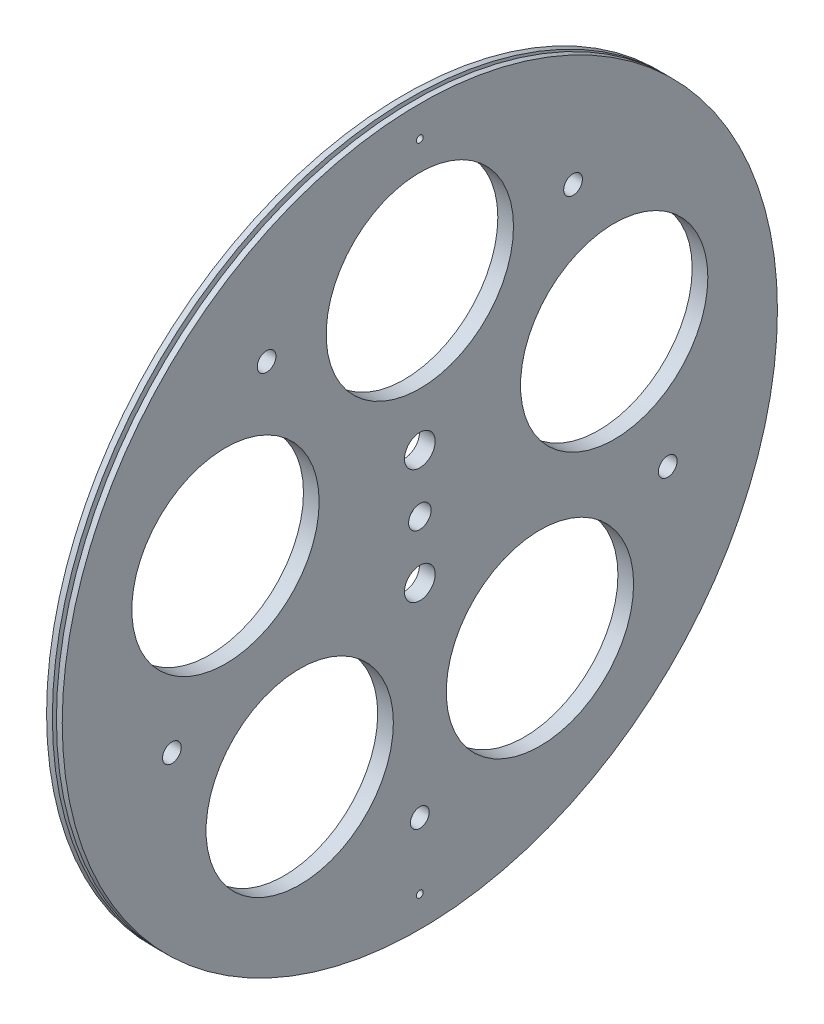
ISO-10303-21;
HEADER;
FILE_DESCRIPTION(('STEP AP214'),'2;1');
FILE_NAME('part.step','',(''),(''),'','','');
FILE_SCHEMA(('AUTOMOTIVE_DESIGN { 1 0 10303 214 1 1 1 1 }'));
ENDSEC;
DATA;
#1=APPLICATION_CONTEXT('core data for automotive mechanical design processes');
#2=APPLICATION_PROTOCOL_DEFINITION('international standard','automotive_design',2000,#1);
#3=PRODUCT_CONTEXT('',#1,'mechanical');
#4=PRODUCT('Part','Part','',(#3));
#5=PRODUCT_RELATED_PRODUCT_CATEGORY('part','',(#4));
#6=PRODUCT_DEFINITION_FORMATION('','',#4);
#7=PRODUCT_DEFINITION_CONTEXT('part definition',#1,'design');
#8=PRODUCT_DEFINITION('design','',#6,#7);
#9=PRODUCT_DEFINITION_SHAPE('','',#8);
#10=(LENGTH_UNIT() NAMED_UNIT(*) SI_UNIT(.MILLI.,.METRE.));
#11=(NAMED_UNIT(*) PLANE_ANGLE_UNIT() SI_UNIT($,.RADIAN.));
#12=(NAMED_UNIT(*) SI_UNIT($,.STERADIAN.) SOLID_ANGLE_UNIT());
#13=UNCERTAINTY_MEASURE_WITH_UNIT(LENGTH_MEASURE(1.E-05),#10,'distance_accuracy_value','');
#14=(GEOMETRIC_REPRESENTATION_CONTEXT(3) GLOBAL_UNCERTAINTY_ASSIGNED_CONTEXT((#13)) GLOBAL_UNIT_ASSIGNED_CONTEXT((#10,
#11,#12)) REPRESENTATION_CONTEXT('',''));
#15=CARTESIAN_POINT('',(0.,0.,0.));
#16=DIRECTION('',(0.,0.,1.));
#17=DIRECTION('',(1.,0.,0.));
#18=AXIS2_PLACEMENT_3D('',#15,#16,#17);
#19=CARTESIAN_POINT('',(-21.9,0.,0.));
#20=DIRECTION('',(1.,0.,0.));
#21=DIRECTION('',(0.,0.,-1.));
#22=AXIS2_PLACEMENT_3D('',#19,#20,#21);
#23=PLANE('',#22);
#24=CARTESIAN_POINT('',(-21.9,16.9,0.));
#25=DIRECTION('',(1.,0.,0.));
#26=DIRECTION('',(0.,0.,-1.));
#27=AXIS2_PLACEMENT_3D('',#24,#25,#26);
#28=CIRCLE('',#27,4.5);
#29=CARTESIAN_POINT('',(-21.9,16.9,-4.5));
#30=VERTEX_POINT('',#29);
#31=EDGE_CURVE('E172',#30,#30,#28,.T.);
#32=ORIENTED_EDGE('',*,*,#31,.F.);
#33=EDGE_LOOP('',(#32));
#34=FACE_BOUND('',#33,.T.);
#35=CARTESIAN_POINT('',(-21.9,-96.,0.));
#36=DIRECTION('',(1.,0.,0.));
#37=DIRECTION('',(0.,0.,-1.));
#38=AXIS2_PLACEMENT_3D('',#35,#36,#37);
#39=CIRCLE('',#38,1.);
#40=CARTESIAN_POINT('',(-21.9,-96.,-1.));
#41=VERTEX_POINT('',#40);
#42=EDGE_CURVE('E176',#41,#41,#39,.F.);
#43=ORIENTED_EDGE('',*,*,#42,.T.);
#44=EDGE_LOOP('',(#43));
#45=FACE_BOUND('',#44,.T.);
#46=CARTESIAN_POINT('',(-21.9,60.,0.));
#47=DIRECTION('',(1.,0.,0.));
#48=DIRECTION('',(0.,0.,-1.));
#49=AXIS2_PLACEMENT_3D('',#46,#47,#48);
#50=CIRCLE('',#49,27.5);
#51=CARTESIAN_POINT('',(-21.9,60.,-27.5));
#52=VERTEX_POINT('',#51);
#53=EDGE_CURVE('E180',#52,#52,#50,.T.);
#54=ORIENTED_EDGE('',*,*,#53,.F.);
#55=EDGE_LOOP('',(#54));
#56=FACE_BOUND('',#55,.T.);
#57=CARTESIAN_POINT('',(-21.9,18.5410196624969,-57.0633909777092));
#58=DIRECTION('',(1.,0.,0.));
#59=DIRECTION('',(0.,0.,-1.));
#60=AXIS2_PLACEMENT_3D('',#57,#58,#59);
#61=CIRCLE('',#60,27.5000000000022);
#62=CARTESIAN_POINT('',(-21.9,18.5410196624969,-84.5633909777114));
#63=VERTEX_POINT('',#62);
#64=EDGE_CURVE('E184',#63,#63,#61,.T.);
#65=ORIENTED_EDGE('',*,*,#64,.F.);
#66=EDGE_LOOP('',(#65));
#67=FACE_BOUND('',#66,.T.);
#68=CARTESIAN_POINT('',(-21.9,-48.5410196624968,-35.2671151375484));
#69=DIRECTION('',(1.,0.,0.));
#70=DIRECTION('',(0.,0.,-1.));
#71=AXIS2_PLACEMENT_3D('',#68,#69,#70);
#72=CIRCLE('',#71,27.5000000000044);
#73=CARTESIAN_POINT('',(-21.9,-48.5410196624968,-62.7671151375528));
#74=VERTEX_POINT('',#73);
#75=EDGE_CURVE('E188',#74,#74,#72,.T.);
#76=ORIENTED_EDGE('',*,*,#75,.F.);
#77=EDGE_LOOP('',(#76));
#78=FACE_BOUND('',#77,.T.);
#79=CARTESIAN_POINT('',(-21.9,-48.5410196624969,35.2671151375484));
#80=DIRECTION('',(1.,0.,0.));
#81=DIRECTION('',(0.,0.,-1.));
#82=AXIS2_PLACEMENT_3D('',#79,#80,#81);
#83=CIRCLE('',#82,27.5000000000036);
#84=CARTESIAN_POINT('',(-21.9,-48.5410196624969,7.76711513754475));
#85=VERTEX_POINT('',#84);
#86=EDGE_CURVE('E192',#85,#85,#83,.T.);
#87=ORIENTED_EDGE('',*,*,#86,.F.);
#88=EDGE_LOOP('',(#87));
#89=FACE_BOUND('',#88,.T.);
#90=CARTESIAN_POINT('',(-21.9,0.,0.));
#91=DIRECTION('',(1.,0.,0.));
#92=DIRECTION('',(0.,0.,-1.));
#93=AXIS2_PLACEMENT_3D('',#90,#91,#92);
#94=CIRCLE('',#93,3.3);
#95=CARTESIAN_POINT('',(-21.9,0.,-3.3));
#96=VERTEX_POINT('',#95);
#97=EDGE_CURVE('E196',#96,#96,#94,.T.);
#98=ORIENTED_EDGE('',*,*,#97,.F.);
#99=EDGE_LOOP('',(#98));
#100=FACE_BOUND('',#99,.T.);
#101=CARTESIAN_POINT('',(-21.9,61.9229856737465,-44.9896825530446));
#102=DIRECTION('',(1.,0.,0.));
#103=DIRECTION('',(0.,0.,-1.));
#104=AXIS2_PLACEMENT_3D('',#101,#102,#103);
#105=CIRCLE('',#104,2.75);
#106=CARTESIAN_POINT('',(-21.9,61.9229856737465,-47.7396825530446));
#107=VERTEX_POINT('',#106);
#108=EDGE_CURVE('E200',#107,#107,#105,.T.);
#109=ORIENTED_EDGE('',*,*,#108,.F.);
#110=EDGE_LOOP('',(#109));
#111=FACE_BOUND('',#110,.T.);
#112=CARTESIAN_POINT('',(-21.9,61.9229856737473,44.9896825530433));
#113=DIRECTION('',(1.,0.,0.));
#114=DIRECTION('',(0.,0.,-1.));
#115=AXIS2_PLACEMENT_3D('',#112,#113,#114);
#116=CIRCLE('',#115,2.75);
#117=CARTESIAN_POINT('',(-21.9,61.9229856737473,42.2396825530433));
#118=VERTEX_POINT('',#117);
#119=EDGE_CURVE('E204',#118,#118,#116,.T.);
#120=ORIENTED_EDGE('',*,*,#119,.F.);
#121=EDGE_LOOP('',(#120));
#122=FACE_BOUND('',#121,.T.);
#123=CARTESIAN_POINT('',(-21.9,-23.6524758424981,72.7948355138932));
#124=DIRECTION('',(1.,0.,0.));
#125=DIRECTION('',(0.,0.,-1.));
#126=AXIS2_PLACEMENT_3D('',#123,#124,#125);
#127=CIRCLE('',#126,2.75000000000001);
#128=CARTESIAN_POINT('',(-21.9,-23.6524758424981,70.0448355138932));
#129=VERTEX_POINT('',#128);
#130=EDGE_CURVE('E208',#129,#129,#127,.T.);
#131=ORIENTED_EDGE('',*,*,#130,.F.);
#132=EDGE_LOOP('',(#131));
#133=FACE_BOUND('',#132,.T.);
#134=CARTESIAN_POINT('',(-21.9,-76.5410196624969,2.1163626406917E-13));
#135=DIRECTION('',(1.,0.,0.));
#136=DIRECTION('',(0.,0.,-1.));
#137=AXIS2_PLACEMENT_3D('',#134,#135,#136);
#138=CIRCLE('',#137,2.75);
#139=CARTESIAN_POINT('',(-21.9,-76.5410196624969,-2.74999999999979));
#140=VERTEX_POINT('',#139);
#141=EDGE_CURVE('E212',#140,#140,#138,.T.);
#142=ORIENTED_EDGE('',*,*,#141,.F.);
#143=EDGE_LOOP('',(#142));
#144=FACE_BOUND('',#143,.T.);
#145=CARTESIAN_POINT('',(-21.9,-23.6524758424985,-72.7948355138931));
#146=DIRECTION('',(1.,0.,0.));
#147=DIRECTION('',(0.,0.,-1.));
#148=AXIS2_PLACEMENT_3D('',#145,#146,#147);
#149=CIRCLE('',#148,2.75000000000001);
#150=CARTESIAN_POINT('',(-21.9,-23.6524758424985,-75.5448355138931));
#151=VERTEX_POINT('',#150);
#152=EDGE_CURVE('E216',#151,#151,#149,.T.);
#153=ORIENTED_EDGE('',*,*,#152,.F.);
#154=EDGE_LOOP('',(#153));
#155=FACE_BOUND('',#154,.T.);
#156=CARTESIAN_POINT('',(-21.9,18.5410196624968,57.0633909777092));
#157=DIRECTION('',(1.,0.,0.));
#158=DIRECTION('',(0.,0.,-1.));
#159=AXIS2_PLACEMENT_3D('',#156,#157,#158);
#160=CIRCLE('',#159,27.5000000000009);
#161=CARTESIAN_POINT('',(-21.9,18.5410196624968,29.5633909777083));
#162=VERTEX_POINT('',#161);
#163=EDGE_CURVE('E102',#162,#162,#160,.T.);
#164=ORIENTED_EDGE('',*,*,#163,.F.);
#165=EDGE_LOOP('',(#164));
#166=FACE_BOUND('',#165,.T.);
#167=CARTESIAN_POINT('',(-21.9,0.,0.));
#168=DIRECTION('',(-1.,0.,0.));
#169=DIRECTION('',(0.,0.,1.));
#170=AXIS2_PLACEMENT_3D('',#167,#168,#169);
#171=CIRCLE('',#170,105.);
#172=CARTESIAN_POINT('',(-21.9,0.,105.));
#173=VERTEX_POINT('',#172);
#174=EDGE_CURVE('E11',#173,#173,#171,.T.);
#175=ORIENTED_EDGE('',*,*,#174,.F.);
#176=EDGE_LOOP('',(#175));
#177=FACE_BOUND('',#176,.T.);
#178=CARTESIAN_POINT('',(-21.9,96.,0.));
#179=DIRECTION('',(1.,0.,0.));
#180=DIRECTION('',(0.,0.,-1.));
#181=AXIS2_PLACEMENT_3D('',#178,#179,#180);
#182=CIRCLE('',#181,1.);
#183=CARTESIAN_POINT('',(-21.9,96.,-1.));
#184=VERTEX_POINT('',#183);
#185=EDGE_CURVE('E225',#184,#184,#182,.T.);
#186=ORIENTED_EDGE('',*,*,#185,.F.);
#187=EDGE_LOOP('',(#186));
#188=FACE_BOUND('',#187,.T.);
#189=CARTESIAN_POINT('',(-21.9,-16.9,0.));
#190=DIRECTION('',(1.,0.,0.));
#191=DIRECTION('',(0.,0.,-1.));
#192=AXIS2_PLACEMENT_3D('',#189,#190,#191);
#193=CIRCLE('',#192,4.5);
#194=CARTESIAN_POINT('',(-21.9,-16.9,-4.5));
#195=VERTEX_POINT('',#194);
#196=EDGE_CURVE('E228',#195,#195,#193,.F.);
#197=ORIENTED_EDGE('',*,*,#196,.T.);
#198=EDGE_LOOP('',(#197));
#199=FACE_BOUND('',#198,.T.);
#200=ADVANCED_FACE('F42',(#34,#45,#56,#67,#78,#89,#100,#111,#122,#133,#144,#155,#166,#177,#188,
#199),#23,.T.);
#201=CARTESIAN_POINT('',(-23.6,0.,0.));
#202=DIRECTION('',(-1.,0.,0.));
#203=DIRECTION('',(0.,0.,1.));
#204=AXIS2_PLACEMENT_3D('',#201,#202,#203);
#205=PLANE('',#204);
#206=CARTESIAN_POINT('',(-23.6,0.,0.));
#207=DIRECTION('',(-1.,0.,0.));
#208=DIRECTION('',(0.,0.,1.));
#209=AXIS2_PLACEMENT_3D('',#206,#207,#208);
#210=CIRCLE('',#209,105.);
#211=CARTESIAN_POINT('',(-23.6,0.,105.));
#212=VERTEX_POINT('',#211);
#213=EDGE_CURVE('E50',#212,#212,#210,.T.);
#214=ORIENTED_EDGE('',*,*,#213,.T.);
#215=EDGE_LOOP('',(#214));
#216=FACE_BOUND('',#215,.T.);
#217=CARTESIAN_POINT('',(-23.6,0.,0.));
#218=DIRECTION('',(-1.,0.,0.));
#219=DIRECTION('',(0.,0.,1.));
#220=AXIS2_PLACEMENT_3D('',#217,#218,#219);
#221=CIRCLE('',#220,95.);
#222=CARTESIAN_POINT('',(-23.6,95.,0.));
#223=VERTEX_POINT('',#222);
#224=CARTESIAN_POINT('',(-23.6,-95.,0.));
#225=VERTEX_POINT('',#224);
#226=EDGE_CURVE('E93',#223,#225,#221,.T.);
#227=ORIENTED_EDGE('',*,*,#226,.F.);
#228=CARTESIAN_POINT('',(-23.6,96.,0.));
#229=DIRECTION('',(-1.,0.,0.));
#230=DIRECTION('',(0.,0.,1.));
#231=AXIS2_PLACEMENT_3D('',#228,#229,#230);
#232=CIRCLE('',#231,1.);
#233=EDGE_CURVE('E61',#223,#223,#232,.T.);
#234=ORIENTED_EDGE('',*,*,#233,.F.);
#235=EDGE_CURVE('E92',#225,#223,#221,.T.);
#236=ORIENTED_EDGE('',*,*,#235,.F.);
#237=CARTESIAN_POINT('',(-23.6,-96.,0.));
#238=DIRECTION('',(-1.,0.,0.));
#239=DIRECTION('',(0.,0.,1.));
#240=AXIS2_PLACEMENT_3D('',#237,#238,#239);
#241=CIRCLE('',#240,1.);
#242=EDGE_CURVE('E56',#225,#225,#241,.F.);
#243=ORIENTED_EDGE('',*,*,#242,.T.);
#244=EDGE_LOOP('',(#227,#234,#236,#243));
#245=FACE_BOUND('',#244,.T.);
#246=ADVANCED_FACE('F161',(#216,#245),#205,.T.);
#247=CARTESIAN_POINT('',(-24.8,0.,0.));
#248=DIRECTION('',(-1.,0.,0.));
#249=DIRECTION('',(0.,0.,1.));
#250=AXIS2_PLACEMENT_3D('',#247,#248,#249);
#251=PLANE('',#250);
#252=CARTESIAN_POINT('',(-24.8,0.,0.));
#253=DIRECTION('',(-1.,0.,0.));
#254=DIRECTION('',(0.,0.,1.));
#255=AXIS2_PLACEMENT_3D('',#252,#253,#254);
#256=CIRCLE('',#255,105.);
#257=CARTESIAN_POINT('',(-24.8,0.,105.));
#258=VERTEX_POINT('',#257);
#259=EDGE_CURVE('E86',#258,#258,#256,.T.);
#260=ORIENTED_EDGE('',*,*,#259,.F.);
#261=EDGE_LOOP('',(#260));
#262=FACE_BOUND('',#261,.T.);
#263=CARTESIAN_POINT('',(-24.8,0.,0.));
#264=DIRECTION('',(-1.,0.,0.));
#265=DIRECTION('',(0.,0.,1.));
#266=AXIS2_PLACEMENT_3D('',#263,#264,#265);
#267=CIRCLE('',#266,95.);
#268=CARTESIAN_POINT('',(-24.8,-95.,0.));
#269=VERTEX_POINT('',#268);
#270=CARTESIAN_POINT('',(-24.8,95.,0.));
#271=VERTEX_POINT('',#270);
#272=EDGE_CURVE('E89',#269,#271,#267,.T.);
#273=ORIENTED_EDGE('',*,*,#272,.T.);
#274=CARTESIAN_POINT('',(-24.8,96.,0.));
#275=DIRECTION('',(-1.,0.,0.));
#276=DIRECTION('',(0.,0.,1.));
#277=AXIS2_PLACEMENT_3D('',#274,#275,#276);
#278=CIRCLE('',#277,1.);
#279=EDGE_CURVE('E69',#271,#271,#278,.T.);
#280=ORIENTED_EDGE('',*,*,#279,.T.);
#281=EDGE_CURVE('E90',#271,#269,#267,.T.);
#282=ORIENTED_EDGE('',*,*,#281,.T.);
#283=CARTESIAN_POINT('',(-24.8,-96.,0.));
#284=DIRECTION('',(-1.,0.,0.));
#285=DIRECTION('',(0.,0.,1.));
#286=AXIS2_PLACEMENT_3D('',#283,#284,#285);
#287=CIRCLE('',#286,1.);
#288=EDGE_CURVE('E134',#269,#269,#287,.F.);
#289=ORIENTED_EDGE('',*,*,#288,.F.);
#290=EDGE_LOOP('',(#273,#280,#282,#289));
#291=FACE_BOUND('',#290,.T.);
#292=ADVANCED_FACE('F167',(#262,#291),#251,.F.);
#293=CARTESIAN_POINT('',(-26.5,0.,0.));
#294=DIRECTION('',(1.,0.,0.));
#295=DIRECTION('',(0.,0.,-1.));
#296=AXIS2_PLACEMENT_3D('',#293,#294,#295);
#297=PLANE('',#296);
#298=CARTESIAN_POINT('',(-26.5,16.9,0.));
#299=DIRECTION('',(1.,0.,0.));
#300=DIRECTION('',(0.,0.,-1.));
#301=AXIS2_PLACEMENT_3D('',#298,#299,#300);
#302=CIRCLE('',#301,4.5);
#303=CARTESIAN_POINT('',(-26.5,16.9,-4.5));
#304=VERTEX_POINT('',#303);
#305=EDGE_CURVE('E45',#304,#304,#302,.T.);
#306=ORIENTED_EDGE('',*,*,#305,.T.);
#307=EDGE_LOOP('',(#306));
#308=FACE_BOUND('',#307,.T.);
#309=CARTESIAN_POINT('',(-26.5,96.,0.));
#310=DIRECTION('',(1.,0.,0.));
#311=DIRECTION('',(0.,0.,-1.));
#312=AXIS2_PLACEMENT_3D('',#309,#310,#311);
#313=CIRCLE('',#312,1.);
#314=CARTESIAN_POINT('',(-26.5,96.,-1.));
#315=VERTEX_POINT('',#314);
#316=EDGE_CURVE('E74',#315,#315,#313,.T.);
#317=ORIENTED_EDGE('',*,*,#316,.T.);
#318=EDGE_LOOP('',(#317));
#319=FACE_BOUND('',#318,.T.);
#320=CARTESIAN_POINT('',(-26.5,60.,0.));
#321=DIRECTION('',(1.,0.,0.));
#322=DIRECTION('',(0.,0.,-1.));
#323=AXIS2_PLACEMENT_3D('',#320,#321,#322);
#324=CIRCLE('',#323,27.5);
#325=CARTESIAN_POINT('',(-26.5,60.,-27.5));
#326=VERTEX_POINT('',#325);
#327=EDGE_CURVE('E129',#326,#326,#324,.T.);
#328=ORIENTED_EDGE('',*,*,#327,.T.);
#329=EDGE_LOOP('',(#328));
#330=FACE_BOUND('',#329,.T.);
#331=CARTESIAN_POINT('',(-26.5,18.5410196624969,-57.0633909777092));
#332=DIRECTION('',(1.,0.,0.));
#333=DIRECTION('',(0.,0.,-1.));
#334=AXIS2_PLACEMENT_3D('',#331,#332,#333);
#335=CIRCLE('',#334,27.5000000000022);
#336=CARTESIAN_POINT('',(-26.5,18.5410196624969,-84.5633909777114));
#337=VERTEX_POINT('',#336);
#338=EDGE_CURVE('E126',#337,#337,#335,.T.);
#339=ORIENTED_EDGE('',*,*,#338,.T.);
#340=EDGE_LOOP('',(#339));
#341=FACE_BOUND('',#340,.T.);
#342=CARTESIAN_POINT('',(-26.5,-48.5410196624968,-35.2671151375484));
#343=DIRECTION('',(1.,0.,0.));
#344=DIRECTION('',(0.,0.,-1.));
#345=AXIS2_PLACEMENT_3D('',#342,#343,#344);
#346=CIRCLE('',#345,27.5000000000044);
#347=CARTESIAN_POINT('',(-26.5,-48.5410196624968,-62.7671151375528));
#348=VERTEX_POINT('',#347);
#349=EDGE_CURVE('E123',#348,#348,#346,.T.);
#350=ORIENTED_EDGE('',*,*,#349,.T.);
#351=EDGE_LOOP('',(#350));
#352=FACE_BOUND('',#351,.T.);
#353=CARTESIAN_POINT('',(-26.5,-48.5410196624969,35.2671151375484));
#354=DIRECTION('',(1.,0.,0.));
#355=DIRECTION('',(0.,0.,-1.));
#356=AXIS2_PLACEMENT_3D('',#353,#354,#355);
#357=CIRCLE('',#356,27.5000000000036);
#358=CARTESIAN_POINT('',(-26.5,-48.5410196624969,7.76711513754475));
#359=VERTEX_POINT('',#358);
#360=EDGE_CURVE('E120',#359,#359,#357,.T.);
#361=ORIENTED_EDGE('',*,*,#360,.T.);
#362=EDGE_LOOP('',(#361));
#363=FACE_BOUND('',#362,.T.);
#364=CARTESIAN_POINT('',(-26.5,0.,0.));
#365=DIRECTION('',(1.,0.,0.));
#366=DIRECTION('',(0.,0.,-1.));
#367=AXIS2_PLACEMENT_3D('',#364,#365,#366);
#368=CIRCLE('',#367,3.3);
#369=CARTESIAN_POINT('',(-26.5,0.,-3.3));
#370=VERTEX_POINT('',#369);
#371=EDGE_CURVE('E117',#370,#370,#368,.T.);
#372=ORIENTED_EDGE('',*,*,#371,.T.);
#373=EDGE_LOOP('',(#372));
#374=FACE_BOUND('',#373,.T.);
#375=CARTESIAN_POINT('',(-26.5,61.9229856737465,-44.9896825530446));
#376=DIRECTION('',(1.,0.,0.));
#377=DIRECTION('',(0.,0.,-1.));
#378=AXIS2_PLACEMENT_3D('',#375,#376,#377);
#379=CIRCLE('',#378,2.75);
#380=CARTESIAN_POINT('',(-26.5,61.9229856737465,-47.7396825530446));
#381=VERTEX_POINT('',#380);
#382=EDGE_CURVE('E114',#381,#381,#379,.T.);
#383=ORIENTED_EDGE('',*,*,#382,.T.);
#384=EDGE_LOOP('',(#383));
#385=FACE_BOUND('',#384,.T.);
#386=CARTESIAN_POINT('',(-26.5,61.9229856737473,44.9896825530433));
#387=DIRECTION('',(1.,0.,0.));
#388=DIRECTION('',(0.,0.,-1.));
#389=AXIS2_PLACEMENT_3D('',#386,#387,#388);
#390=CIRCLE('',#389,2.75);
#391=CARTESIAN_POINT('',(-26.5,61.9229856737473,42.2396825530433));
#392=VERTEX_POINT('',#391);
#393=EDGE_CURVE('E111',#392,#392,#390,.T.);
#394=ORIENTED_EDGE('',*,*,#393,.T.);
#395=EDGE_LOOP('',(#394));
#396=FACE_BOUND('',#395,.T.);
#397=CARTESIAN_POINT('',(-26.5,-23.6524758424981,72.7948355138932));
#398=DIRECTION('',(1.,0.,0.));
#399=DIRECTION('',(0.,0.,-1.));
#400=AXIS2_PLACEMENT_3D('',#397,#398,#399);
#401=CIRCLE('',#400,2.75000000000001);
#402=CARTESIAN_POINT('',(-26.5,-23.6524758424981,70.0448355138932));
#403=VERTEX_POINT('',#402);
#404=EDGE_CURVE('E108',#403,#403,#401,.T.);
#405=ORIENTED_EDGE('',*,*,#404,.T.);
#406=EDGE_LOOP('',(#405));
#407=FACE_BOUND('',#406,.T.);
#408=CARTESIAN_POINT('',(-26.5,-76.5410196624969,2.1163626406917E-13));
#409=DIRECTION('',(1.,0.,0.));
#410=DIRECTION('',(0.,0.,-1.));
#411=AXIS2_PLACEMENT_3D('',#408,#409,#410);
#412=CIRCLE('',#411,2.75);
#413=CARTESIAN_POINT('',(-26.5,-76.5410196624969,-2.74999999999979));
#414=VERTEX_POINT('',#413);
#415=EDGE_CURVE('E105',#414,#414,#412,.T.);
#416=ORIENTED_EDGE('',*,*,#415,.T.);
#417=EDGE_LOOP('',(#416));
#418=FACE_BOUND('',#417,.T.);
#419=CARTESIAN_POINT('',(-26.5,-23.6524758424985,-72.7948355138931));
#420=DIRECTION('',(1.,0.,0.));
#421=DIRECTION('',(0.,0.,-1.));
#422=AXIS2_PLACEMENT_3D('',#419,#420,#421);
#423=CIRCLE('',#422,2.75000000000001);
#424=CARTESIAN_POINT('',(-26.5,-23.6524758424985,-75.5448355138931));
#425=VERTEX_POINT('',#424);
#426=EDGE_CURVE('E101',#425,#425,#423,.T.);
#427=ORIENTED_EDGE('',*,*,#426,.T.);
#428=EDGE_LOOP('',(#427));
#429=FACE_BOUND('',#428,.T.);
#430=CARTESIAN_POINT('',(-26.5,18.5410196624968,57.0633909777092));
#431=DIRECTION('',(1.,0.,0.));
#432=DIRECTION('',(0.,0.,-1.));
#433=AXIS2_PLACEMENT_3D('',#430,#431,#432);
#434=CIRCLE('',#433,27.5000000000009);
#435=CARTESIAN_POINT('',(-26.5,18.5410196624968,29.5633909777083));
#436=VERTEX_POINT('',#435);
#437=EDGE_CURVE('E98',#436,#436,#434,.T.);
#438=ORIENTED_EDGE('',*,*,#437,.T.);
#439=EDGE_LOOP('',(#438));
#440=FACE_BOUND('',#439,.T.);
#441=CARTESIAN_POINT('',(-26.5,0.,0.));
#442=DIRECTION('',(-1.,0.,0.));
#443=DIRECTION('',(0.,0.,1.));
#444=AXIS2_PLACEMENT_3D('',#441,#442,#443);
#445=CIRCLE('',#444,105.);
#446=CARTESIAN_POINT('',(-26.5,0.,105.));
#447=VERTEX_POINT('',#446);
#448=EDGE_CURVE('E83',#447,#447,#445,.T.);
#449=ORIENTED_EDGE('',*,*,#448,.T.);
#450=EDGE_LOOP('',(#449));
#451=FACE_BOUND('',#450,.T.);
#452=CARTESIAN_POINT('',(-26.5,-96.,0.));
#453=DIRECTION('',(1.,0.,0.));
#454=DIRECTION('',(0.,0.,-1.));
#455=AXIS2_PLACEMENT_3D('',#452,#453,#454);
#456=CIRCLE('',#455,1.);
#457=CARTESIAN_POINT('',(-26.5,-96.,-1.));
#458=VERTEX_POINT('',#457);
#459=EDGE_CURVE('E132',#458,#458,#456,.F.);
#460=ORIENTED_EDGE('',*,*,#459,.F.);
#461=EDGE_LOOP('',(#460));
#462=FACE_BOUND('',#461,.T.);
#463=CARTESIAN_POINT('',(-26.5,-16.9,0.));
#464=DIRECTION('',(1.,0.,0.));
#465=DIRECTION('',(0.,0.,-1.));
#466=AXIS2_PLACEMENT_3D('',#463,#464,#465);
#467=CIRCLE('',#466,4.5);
#468=CARTESIAN_POINT('',(-26.5,-16.9,-4.5));
#469=VERTEX_POINT('',#468);
#470=EDGE_CURVE('E76',#469,#469,#467,.F.);
#471=ORIENTED_EDGE('',*,*,#470,.F.);
#472=EDGE_LOOP('',(#471));
#473=FACE_BOUND('',#472,.T.);
#474=ADVANCED_FACE('F141',(#308,#319,#330,#341,#352,#363,#374,#385,#396,#407,#418,#429,#440,
#451,#462,#473),#297,.F.);
#475=CARTESIAN_POINT('',(-21.,0.,0.));
#476=DIRECTION('',(-1.,0.,0.));
#477=DIRECTION('',(0.,0.,1.));
#478=AXIS2_PLACEMENT_3D('',#475,#476,#477);
#479=CYLINDRICAL_SURFACE('',#478,105.);
#480=ORIENTED_EDGE('',*,*,#213,.F.);
#481=EDGE_LOOP('',(#480));
#482=FACE_BOUND('',#481,.T.);
#483=ORIENTED_EDGE('',*,*,#174,.T.);
#484=EDGE_LOOP('',(#483));
#485=FACE_BOUND('',#484,.T.);
#486=ADVANCED_FACE('F249',(#482,#485),#479,.T.);
#487=CARTESIAN_POINT('',(-21.,0.,0.));
#488=DIRECTION('',(-1.,0.,0.));
#489=DIRECTION('',(0.,0.,1.));
#490=AXIS2_PLACEMENT_3D('',#487,#488,#489);
#491=CYLINDRICAL_SURFACE('',#490,95.);
#492=ORIENTED_EDGE('',*,*,#235,.T.);
#493=ORIENTED_EDGE('',*,*,#226,.T.);
#494=EDGE_LOOP('',(#492,#493));
#495=FACE_BOUND('',#494,.T.);
#496=ORIENTED_EDGE('',*,*,#281,.F.);
#497=ORIENTED_EDGE('',*,*,#272,.F.);
#498=EDGE_LOOP('',(#496,#497));
#499=FACE_BOUND('',#498,.T.);
#500=ADVANCED_FACE('F245',(#495,#499),#491,.T.);
#501=CARTESIAN_POINT('',(-21.,0.,0.));
#502=DIRECTION('',(-1.,0.,0.));
#503=DIRECTION('',(0.,0.,1.));
#504=AXIS2_PLACEMENT_3D('',#501,#502,#503);
#505=CYLINDRICAL_SURFACE('',#504,105.);
#506=ORIENTED_EDGE('',*,*,#448,.F.);
#507=EDGE_LOOP('',(#506));
#508=FACE_BOUND('',#507,.T.);
#509=ORIENTED_EDGE('',*,*,#259,.T.);
#510=EDGE_LOOP('',(#509));
#511=FACE_BOUND('',#510,.T.);
#512=ADVANCED_FACE('F248',(#508,#511),#505,.T.);
#513=CARTESIAN_POINT('',(-31.9,18.5410196624968,57.0633909777092));
#514=DIRECTION('',(1.,0.,0.));
#515=DIRECTION('',(0.,0.,-1.));
#516=AXIS2_PLACEMENT_3D('',#513,#514,#515);
#517=CYLINDRICAL_SURFACE('',#516,27.5000000000009);
#518=ORIENTED_EDGE('',*,*,#163,.T.);
#519=EDGE_LOOP('',(#518));
#520=FACE_BOUND('',#519,.T.);
#521=ORIENTED_EDGE('',*,*,#437,.F.);
#522=EDGE_LOOP('',(#521));
#523=FACE_BOUND('',#522,.T.);
#524=ADVANCED_FACE('F274',(#520,#523),#517,.F.);
#525=CARTESIAN_POINT('',(-31.9,-23.6524758424985,-72.7948355138931));
#526=DIRECTION('',(1.,0.,0.));
#527=DIRECTION('',(0.,0.,-1.));
#528=AXIS2_PLACEMENT_3D('',#525,#526,#527);
#529=CYLINDRICAL_SURFACE('',#528,2.75000000000001);
#530=ORIENTED_EDGE('',*,*,#152,.T.);
#531=EDGE_LOOP('',(#530));
#532=FACE_BOUND('',#531,.T.);
#533=ORIENTED_EDGE('',*,*,#426,.F.);
#534=EDGE_LOOP('',(#533));
#535=FACE_BOUND('',#534,.T.);
#536=ADVANCED_FACE('F311',(#532,#535),#529,.F.);
#537=CARTESIAN_POINT('',(-31.9,-76.5410196624969,2.1163626406917E-13));
#538=DIRECTION('',(1.,0.,0.));
#539=DIRECTION('',(0.,0.,-1.));
#540=AXIS2_PLACEMENT_3D('',#537,#538,#539);
#541=CYLINDRICAL_SURFACE('',#540,2.75);
#542=ORIENTED_EDGE('',*,*,#141,.T.);
#543=EDGE_LOOP('',(#542));
#544=FACE_BOUND('',#543,.T.);
#545=ORIENTED_EDGE('',*,*,#415,.F.);
#546=EDGE_LOOP('',(#545));
#547=FACE_BOUND('',#546,.T.);
#548=ADVANCED_FACE('F319',(#544,#547),#541,.F.);
#549=CARTESIAN_POINT('',(-31.9,-23.6524758424981,72.7948355138932));
#550=DIRECTION('',(1.,0.,0.));
#551=DIRECTION('',(0.,0.,-1.));
#552=AXIS2_PLACEMENT_3D('',#549,#550,#551);
#553=CYLINDRICAL_SURFACE('',#552,2.75000000000001);
#554=ORIENTED_EDGE('',*,*,#130,.T.);
#555=EDGE_LOOP('',(#554));
#556=FACE_BOUND('',#555,.T.);
#557=ORIENTED_EDGE('',*,*,#404,.F.);
#558=EDGE_LOOP('',(#557));
#559=FACE_BOUND('',#558,.T.);
#560=ADVANCED_FACE('F327',(#556,#559),#553,.F.);
#561=CARTESIAN_POINT('',(-31.9,61.9229856737473,44.9896825530433));
#562=DIRECTION('',(1.,0.,0.));
#563=DIRECTION('',(0.,0.,-1.));
#564=AXIS2_PLACEMENT_3D('',#561,#562,#563);
#565=CYLINDRICAL_SURFACE('',#564,2.75);
#566=ORIENTED_EDGE('',*,*,#119,.T.);
#567=EDGE_LOOP('',(#566));
#568=FACE_BOUND('',#567,.T.);
#569=ORIENTED_EDGE('',*,*,#393,.F.);
#570=EDGE_LOOP('',(#569));
#571=FACE_BOUND('',#570,.T.);
#572=ADVANCED_FACE('F335',(#568,#571),#565,.F.);
#573=CARTESIAN_POINT('',(-31.9,61.9229856737465,-44.9896825530446));
#574=DIRECTION('',(1.,0.,0.));
#575=DIRECTION('',(0.,0.,-1.));
#576=AXIS2_PLACEMENT_3D('',#573,#574,#575);
#577=CYLINDRICAL_SURFACE('',#576,2.75);
#578=ORIENTED_EDGE('',*,*,#108,.T.);
#579=EDGE_LOOP('',(#578));
#580=FACE_BOUND('',#579,.T.);
#581=ORIENTED_EDGE('',*,*,#382,.F.);
#582=EDGE_LOOP('',(#581));
#583=FACE_BOUND('',#582,.T.);
#584=ADVANCED_FACE('F343',(#580,#583),#577,.F.);
#585=CARTESIAN_POINT('',(-31.9,0.,0.));
#586=DIRECTION('',(1.,0.,0.));
#587=DIRECTION('',(0.,0.,-1.));
#588=AXIS2_PLACEMENT_3D('',#585,#586,#587);
#589=CYLINDRICAL_SURFACE('',#588,3.3);
#590=ORIENTED_EDGE('',*,*,#97,.T.);
#591=EDGE_LOOP('',(#590));
#592=FACE_BOUND('',#591,.T.);
#593=ORIENTED_EDGE('',*,*,#371,.F.);
#594=EDGE_LOOP('',(#593));
#595=FACE_BOUND('',#594,.T.);
#596=ADVANCED_FACE('F351',(#592,#595),#589,.F.);
#597=CARTESIAN_POINT('',(-31.9,-48.5410196624969,35.2671151375484));
#598=DIRECTION('',(1.,0.,0.));
#599=DIRECTION('',(0.,0.,-1.));
#600=AXIS2_PLACEMENT_3D('',#597,#598,#599);
#601=CYLINDRICAL_SURFACE('',#600,27.5000000000036);
#602=ORIENTED_EDGE('',*,*,#86,.T.);
#603=EDGE_LOOP('',(#602));
#604=FACE_BOUND('',#603,.T.);
#605=ORIENTED_EDGE('',*,*,#360,.F.);
#606=EDGE_LOOP('',(#605));
#607=FACE_BOUND('',#606,.T.);
#608=ADVANCED_FACE('F359',(#604,#607),#601,.F.);
#609=CARTESIAN_POINT('',(-31.9,-48.5410196624968,-35.2671151375484));
#610=DIRECTION('',(1.,0.,0.));
#611=DIRECTION('',(0.,0.,-1.));
#612=AXIS2_PLACEMENT_3D('',#609,#610,#611);
#613=CYLINDRICAL_SURFACE('',#612,27.5000000000044);
#614=ORIENTED_EDGE('',*,*,#75,.T.);
#615=EDGE_LOOP('',(#614));
#616=FACE_BOUND('',#615,.T.);
#617=ORIENTED_EDGE('',*,*,#349,.F.);
#618=EDGE_LOOP('',(#617));
#619=FACE_BOUND('',#618,.T.);
#620=ADVANCED_FACE('F367',(#616,#619),#613,.F.);
#621=CARTESIAN_POINT('',(-31.9,18.5410196624969,-57.0633909777092));
#622=DIRECTION('',(1.,0.,0.));
#623=DIRECTION('',(0.,0.,-1.));
#624=AXIS2_PLACEMENT_3D('',#621,#622,#623);
#625=CYLINDRICAL_SURFACE('',#624,27.5000000000022);
#626=ORIENTED_EDGE('',*,*,#64,.T.);
#627=EDGE_LOOP('',(#626));
#628=FACE_BOUND('',#627,.T.);
#629=ORIENTED_EDGE('',*,*,#338,.F.);
#630=EDGE_LOOP('',(#629));
#631=FACE_BOUND('',#630,.T.);
#632=ADVANCED_FACE('F375',(#628,#631),#625,.F.);
#633=CARTESIAN_POINT('',(-31.9,60.,0.));
#634=DIRECTION('',(1.,0.,0.));
#635=DIRECTION('',(0.,0.,-1.));
#636=AXIS2_PLACEMENT_3D('',#633,#634,#635);
#637=CYLINDRICAL_SURFACE('',#636,27.5);
#638=ORIENTED_EDGE('',*,*,#53,.T.);
#639=EDGE_LOOP('',(#638));
#640=FACE_BOUND('',#639,.T.);
#641=ORIENTED_EDGE('',*,*,#327,.F.);
#642=EDGE_LOOP('',(#641));
#643=FACE_BOUND('',#642,.T.);
#644=ADVANCED_FACE('F383',(#640,#643),#637,.F.);
#645=CARTESIAN_POINT('',(-31.9,-96.,0.));
#646=DIRECTION('',(1.,0.,0.));
#647=DIRECTION('',(0.,0.,-1.));
#648=AXIS2_PLACEMENT_3D('',#645,#646,#647);
#649=CYLINDRICAL_SURFACE('',#648,1.);
#650=ORIENTED_EDGE('',*,*,#459,.T.);
#651=EDGE_LOOP('',(#650));
#652=FACE_BOUND('',#651,.T.);
#653=ORIENTED_EDGE('',*,*,#288,.T.);
#654=EDGE_LOOP('',(#653));
#655=FACE_BOUND('',#654,.T.);
#656=ADVANCED_FACE('F156',(#652,#655),#649,.F.);
#657=CARTESIAN_POINT('',(-31.9,96.,0.));
#658=DIRECTION('',(1.,0.,0.));
#659=DIRECTION('',(0.,0.,-1.));
#660=AXIS2_PLACEMENT_3D('',#657,#658,#659);
#661=CYLINDRICAL_SURFACE('',#660,1.);
#662=ORIENTED_EDGE('',*,*,#316,.F.);
#663=EDGE_LOOP('',(#662));
#664=FACE_BOUND('',#663,.T.);
#665=ORIENTED_EDGE('',*,*,#279,.F.);
#666=EDGE_LOOP('',(#665));
#667=FACE_BOUND('',#666,.T.);
#668=ADVANCED_FACE('F70',(#664,#667),#661,.F.);
#669=CARTESIAN_POINT('',(-31.9,-16.9,0.));
#670=DIRECTION('',(1.,0.,0.));
#671=DIRECTION('',(0.,0.,-1.));
#672=AXIS2_PLACEMENT_3D('',#669,#670,#671);
#673=CYLINDRICAL_SURFACE('',#672,4.5);
#674=ORIENTED_EDGE('',*,*,#196,.F.);
#675=EDGE_LOOP('',(#674));
#676=FACE_BOUND('',#675,.T.);
#677=ORIENTED_EDGE('',*,*,#470,.T.);
#678=EDGE_LOOP('',(#677));
#679=FACE_BOUND('',#678,.T.);
#680=ADVANCED_FACE('F147',(#676,#679),#673,.F.);
#681=CARTESIAN_POINT('',(-31.9,16.9,0.));
#682=DIRECTION('',(1.,0.,0.));
#683=DIRECTION('',(0.,0.,-1.));
#684=AXIS2_PLACEMENT_3D('',#681,#682,#683);
#685=CYLINDRICAL_SURFACE('',#684,4.5);
#686=ORIENTED_EDGE('',*,*,#31,.T.);
#687=EDGE_LOOP('',(#686));
#688=FACE_BOUND('',#687,.T.);
#689=ORIENTED_EDGE('',*,*,#305,.F.);
#690=EDGE_LOOP('',(#689));
#691=FACE_BOUND('',#690,.T.);
#692=ADVANCED_FACE('F144',(#688,#691),#685,.F.);
#693=ORIENTED_EDGE('',*,*,#242,.F.);
#694=EDGE_LOOP('',(#693));
#695=FACE_BOUND('',#694,.T.);
#696=ORIENTED_EDGE('',*,*,#42,.F.);
#697=EDGE_LOOP('',(#696));
#698=FACE_BOUND('',#697,.T.);
#699=ADVANCED_FACE('F146',(#695,#698),#649,.F.);
#700=ORIENTED_EDGE('',*,*,#233,.T.);
#701=EDGE_LOOP('',(#700));
#702=FACE_BOUND('',#701,.T.);
#703=ORIENTED_EDGE('',*,*,#185,.T.);
#704=EDGE_LOOP('',(#703));
#705=FACE_BOUND('',#704,.T.);
#706=ADVANCED_FACE('F154',(#702,#705),#661,.F.);
#707=CLOSED_SHELL('',(#200,#246,#292,#474,#486,#500,#512,#524,#536,#548,#560,#572,#584,#596,
#608,#620,#632,#644,#656,#668,#680,#692,#699,#706));
#708=MANIFOLD_SOLID_BREP('B2',#707);
#709=ADVANCED_BREP_SHAPE_REPRESENTATION('',(#18,#708),#14);
#710=SHAPE_DEFINITION_REPRESENTATION(#9,#709);
ENDSEC;
END-ISO-10303-21;
